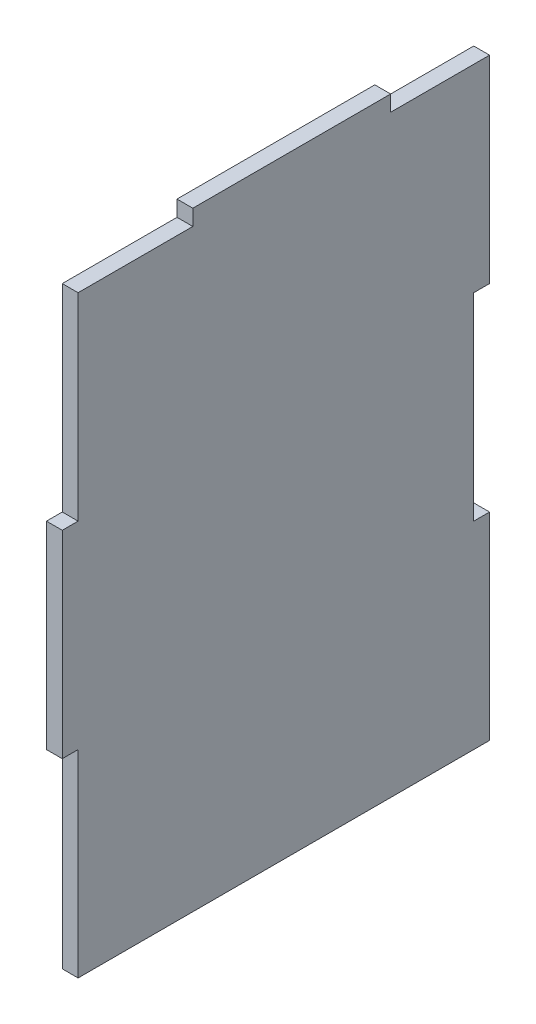
ISO-10303-21;
HEADER;
FILE_DESCRIPTION(('STEP AP214'),'2;1');
FILE_NAME('part.step','',(''),(''),'','','');
FILE_SCHEMA(('AUTOMOTIVE_DESIGN { 1 0 10303 214 1 1 1 1 }'));
ENDSEC;
DATA;
#1=APPLICATION_CONTEXT('core data for automotive mechanical design processes');
#2=APPLICATION_PROTOCOL_DEFINITION('international standard','automotive_design',2000,#1);
#3=PRODUCT_CONTEXT('',#1,'mechanical');
#4=PRODUCT('Part','Part','',(#3));
#5=PRODUCT_RELATED_PRODUCT_CATEGORY('part','',(#4));
#6=PRODUCT_DEFINITION_FORMATION('','',#4);
#7=PRODUCT_DEFINITION_CONTEXT('part definition',#1,'design');
#8=PRODUCT_DEFINITION('design','',#6,#7);
#9=PRODUCT_DEFINITION_SHAPE('','',#8);
#10=(LENGTH_UNIT() NAMED_UNIT(*) SI_UNIT(.MILLI.,.METRE.));
#11=(NAMED_UNIT(*) PLANE_ANGLE_UNIT() SI_UNIT($,.RADIAN.));
#12=(NAMED_UNIT(*) SI_UNIT($,.STERADIAN.) SOLID_ANGLE_UNIT());
#13=UNCERTAINTY_MEASURE_WITH_UNIT(LENGTH_MEASURE(1.E-05),#10,'distance_accuracy_value','');
#14=(GEOMETRIC_REPRESENTATION_CONTEXT(3) GLOBAL_UNCERTAINTY_ASSIGNED_CONTEXT((#13)) GLOBAL_UNIT_ASSIGNED_CONTEXT((#10,
#11,#12)) REPRESENTATION_CONTEXT('',''));
#15=CARTESIAN_POINT('',(0.,0.,0.));
#16=DIRECTION('',(0.,0.,1.));
#17=DIRECTION('',(1.,0.,0.));
#18=AXIS2_PLACEMENT_3D('',#15,#16,#17);
#19=CARTESIAN_POINT('',(4.,0.,0.));
#20=DIRECTION('',(0.,1.,0.));
#21=DIRECTION('',(0.,0.,1.));
#22=AXIS2_PLACEMENT_3D('',#19,#20,#21);
#23=PLANE('',#22);
#24=DIRECTION('',(0.,0.,-1.));
#25=VECTOR('',#24,1.);
#26=CARTESIAN_POINT('',(0.,0.,0.));
#27=LINE('',#26,#25);
#28=CARTESIAN_POINT('',(0.,0.,3.99999999999998));
#29=VERTEX_POINT('',#28);
#30=CARTESIAN_POINT('',(0.,0.,-100.));
#31=VERTEX_POINT('',#30);
#32=EDGE_CURVE('E123',#29,#31,#27,.T.);
#33=ORIENTED_EDGE('',*,*,#32,.T.);
#34=DIRECTION('',(-1.,0.,0.));
#35=VECTOR('',#34,1.);
#36=CARTESIAN_POINT('',(4.,0.,-100.));
#37=LINE('',#36,#35);
#38=CARTESIAN_POINT('',(4.,0.,-100.));
#39=VERTEX_POINT('',#38);
#40=EDGE_CURVE('E11',#39,#31,#37,.T.);
#41=ORIENTED_EDGE('',*,*,#40,.F.);
#42=DIRECTION('',(0.,0.,-1.));
#43=VECTOR('',#42,1.);
#44=CARTESIAN_POINT('',(4.,0.,3.99999999999998));
#45=LINE('',#44,#43);
#46=CARTESIAN_POINT('',(4.,0.,3.99999999999998));
#47=VERTEX_POINT('',#46);
#48=EDGE_CURVE('E129',#47,#39,#45,.T.);
#49=ORIENTED_EDGE('',*,*,#48,.F.);
#50=DIRECTION('',(-1.,0.,0.));
#51=VECTOR('',#50,1.);
#52=CARTESIAN_POINT('',(4.,0.,3.99999999999998));
#53=LINE('',#52,#51);
#54=EDGE_CURVE('E187',#47,#29,#53,.T.);
#55=ORIENTED_EDGE('',*,*,#54,.T.);
#56=EDGE_LOOP('',(#33,#41,#49,#55));
#57=FACE_BOUND('',#56,.T.);
#58=ADVANCED_FACE('F47',(#57),#23,.F.);
#59=CARTESIAN_POINT('',(4.,0.,-100.));
#60=DIRECTION('',(0.,0.,1.));
#61=DIRECTION('',(1.,0.,0.));
#62=AXIS2_PLACEMENT_3D('',#59,#60,#61);
#63=PLANE('',#62);
#64=DIRECTION('',(0.,1.,0.));
#65=VECTOR('',#64,1.);
#66=CARTESIAN_POINT('',(0.,0.,-100.));
#67=LINE('',#66,#65);
#68=CARTESIAN_POINT('',(0.,50.,-100.));
#69=VERTEX_POINT('',#68);
#70=EDGE_CURVE('E192',#31,#69,#67,.T.);
#71=ORIENTED_EDGE('',*,*,#70,.T.);
#72=DIRECTION('',(-1.,0.,0.));
#73=VECTOR('',#72,1.);
#74=CARTESIAN_POINT('',(4.,50.,-100.));
#75=LINE('',#74,#73);
#76=CARTESIAN_POINT('',(4.,50.,-100.));
#77=VERTEX_POINT('',#76);
#78=EDGE_CURVE('E55',#77,#69,#75,.T.);
#79=ORIENTED_EDGE('',*,*,#78,.F.);
#80=DIRECTION('',(0.,1.,0.));
#81=VECTOR('',#80,1.);
#82=CARTESIAN_POINT('',(4.,0.,-100.));
#83=LINE('',#82,#81);
#84=EDGE_CURVE('E309',#39,#77,#83,.T.);
#85=ORIENTED_EDGE('',*,*,#84,.F.);
#86=ORIENTED_EDGE('',*,*,#40,.T.);
#87=EDGE_LOOP('',(#71,#79,#85,#86));
#88=FACE_BOUND('',#87,.T.);
#89=ADVANCED_FACE('F312',(#88),#63,.F.);
#90=CARTESIAN_POINT('',(4.,50.,-96.));
#91=DIRECTION('',(0.,-1.,0.));
#92=DIRECTION('',(0.,0.,-1.));
#93=AXIS2_PLACEMENT_3D('',#90,#91,#92);
#94=PLANE('',#93);
#95=DIRECTION('',(0.,0.,1.));
#96=VECTOR('',#95,1.);
#97=CARTESIAN_POINT('',(0.,50.,-96.));
#98=LINE('',#97,#96);
#99=CARTESIAN_POINT('',(0.,50.,-96.));
#100=VERTEX_POINT('',#99);
#101=EDGE_CURVE('E194',#69,#100,#98,.T.);
#102=ORIENTED_EDGE('',*,*,#101,.T.);
#103=DIRECTION('',(-1.,0.,0.));
#104=VECTOR('',#103,1.);
#105=CARTESIAN_POINT('',(4.,50.,-96.));
#106=LINE('',#105,#104);
#107=CARTESIAN_POINT('',(4.,50.,-96.));
#108=VERTEX_POINT('',#107);
#109=EDGE_CURVE('E252',#108,#100,#106,.T.);
#110=ORIENTED_EDGE('',*,*,#109,.F.);
#111=DIRECTION('',(0.,0.,1.));
#112=VECTOR('',#111,1.);
#113=CARTESIAN_POINT('',(4.,50.,-96.));
#114=LINE('',#113,#112);
#115=EDGE_CURVE('E261',#77,#108,#114,.T.);
#116=ORIENTED_EDGE('',*,*,#115,.F.);
#117=ORIENTED_EDGE('',*,*,#78,.T.);
#118=EDGE_LOOP('',(#102,#110,#116,#117));
#119=FACE_BOUND('',#118,.T.);
#120=ADVANCED_FACE('F259',(#119),#94,.F.);
#121=CARTESIAN_POINT('',(4.,100.,-96.));
#122=DIRECTION('',(0.,0.,1.));
#123=DIRECTION('',(1.,0.,0.));
#124=AXIS2_PLACEMENT_3D('',#121,#122,#123);
#125=PLANE('',#124);
#126=DIRECTION('',(0.,1.,0.));
#127=VECTOR('',#126,1.);
#128=CARTESIAN_POINT('',(0.,100.,-96.));
#129=LINE('',#128,#127);
#130=CARTESIAN_POINT('',(0.,100.,-96.));
#131=VERTEX_POINT('',#130);
#132=EDGE_CURVE('E196',#100,#131,#129,.T.);
#133=ORIENTED_EDGE('',*,*,#132,.T.);
#134=DIRECTION('',(-1.,0.,0.));
#135=VECTOR('',#134,1.);
#136=CARTESIAN_POINT('',(4.,100.,-96.));
#137=LINE('',#136,#135);
#138=CARTESIAN_POINT('',(4.,100.,-96.));
#139=VERTEX_POINT('',#138);
#140=EDGE_CURVE('E249',#139,#131,#137,.T.);
#141=ORIENTED_EDGE('',*,*,#140,.F.);
#142=DIRECTION('',(0.,1.,0.));
#143=VECTOR('',#142,1.);
#144=CARTESIAN_POINT('',(4.,100.,-96.));
#145=LINE('',#144,#143);
#146=EDGE_CURVE('E279',#108,#139,#145,.T.);
#147=ORIENTED_EDGE('',*,*,#146,.F.);
#148=ORIENTED_EDGE('',*,*,#109,.T.);
#149=EDGE_LOOP('',(#133,#141,#147,#148));
#150=FACE_BOUND('',#149,.T.);
#151=ADVANCED_FACE('F270',(#150),#125,.F.);
#152=CARTESIAN_POINT('',(4.,100.,-100.));
#153=DIRECTION('',(0.,1.,0.));
#154=DIRECTION('',(0.,0.,1.));
#155=AXIS2_PLACEMENT_3D('',#152,#153,#154);
#156=PLANE('',#155);
#157=DIRECTION('',(0.,0.,-1.));
#158=VECTOR('',#157,1.);
#159=CARTESIAN_POINT('',(0.,100.,-100.));
#160=LINE('',#159,#158);
#161=CARTESIAN_POINT('',(0.,100.,-100.));
#162=VERTEX_POINT('',#161);
#163=EDGE_CURVE('E198',#131,#162,#160,.T.);
#164=ORIENTED_EDGE('',*,*,#163,.T.);
#165=DIRECTION('',(-1.,0.,0.));
#166=VECTOR('',#165,1.);
#167=CARTESIAN_POINT('',(4.,100.,-100.));
#168=LINE('',#167,#166);
#169=CARTESIAN_POINT('',(4.,100.,-100.));
#170=VERTEX_POINT('',#169);
#171=EDGE_CURVE('E246',#170,#162,#168,.T.);
#172=ORIENTED_EDGE('',*,*,#171,.F.);
#173=DIRECTION('',(0.,0.,-1.));
#174=VECTOR('',#173,1.);
#175=CARTESIAN_POINT('',(4.,100.,-100.));
#176=LINE('',#175,#174);
#177=EDGE_CURVE('E276',#139,#170,#176,.T.);
#178=ORIENTED_EDGE('',*,*,#177,.F.);
#179=ORIENTED_EDGE('',*,*,#140,.T.);
#180=EDGE_LOOP('',(#164,#172,#178,#179));
#181=FACE_BOUND('',#180,.T.);
#182=ADVANCED_FACE('F274',(#181),#156,.F.);
#183=CARTESIAN_POINT('',(4.,100.,-100.));
#184=DIRECTION('',(0.,0.,1.));
#185=DIRECTION('',(1.,0.,0.));
#186=AXIS2_PLACEMENT_3D('',#183,#184,#185);
#187=PLANE('',#186);
#188=DIRECTION('',(0.,1.,0.));
#189=VECTOR('',#188,1.);
#190=CARTESIAN_POINT('',(0.,100.,-100.));
#191=LINE('',#190,#189);
#192=CARTESIAN_POINT('',(0.,150.,-100.));
#193=VERTEX_POINT('',#192);
#194=EDGE_CURVE('E200',#162,#193,#191,.T.);
#195=ORIENTED_EDGE('',*,*,#194,.T.);
#196=DIRECTION('',(-1.,0.,0.));
#197=VECTOR('',#196,1.);
#198=CARTESIAN_POINT('',(4.,150.,-100.));
#199=LINE('',#198,#197);
#200=CARTESIAN_POINT('',(4.,150.,-100.));
#201=VERTEX_POINT('',#200);
#202=EDGE_CURVE('E243',#201,#193,#199,.T.);
#203=ORIENTED_EDGE('',*,*,#202,.F.);
#204=DIRECTION('',(0.,1.,0.));
#205=VECTOR('',#204,1.);
#206=CARTESIAN_POINT('',(4.,100.,-100.));
#207=LINE('',#206,#205);
#208=EDGE_CURVE('E278',#170,#201,#207,.T.);
#209=ORIENTED_EDGE('',*,*,#208,.F.);
#210=ORIENTED_EDGE('',*,*,#171,.T.);
#211=EDGE_LOOP('',(#195,#203,#209,#210));
#212=FACE_BOUND('',#211,.T.);
#213=ADVANCED_FACE('F324',(#212),#187,.F.);
#214=CARTESIAN_POINT('',(4.,150.,-100.));
#215=DIRECTION('',(0.,-1.,0.));
#216=DIRECTION('',(0.,0.,-1.));
#217=AXIS2_PLACEMENT_3D('',#214,#215,#216);
#218=PLANE('',#217);
#219=DIRECTION('',(0.,0.,1.));
#220=VECTOR('',#219,1.);
#221=CARTESIAN_POINT('',(0.,150.,-100.));
#222=LINE('',#221,#220);
#223=CARTESIAN_POINT('',(0.,150.,-75.));
#224=VERTEX_POINT('',#223);
#225=EDGE_CURVE('E202',#193,#224,#222,.T.);
#226=ORIENTED_EDGE('',*,*,#225,.T.);
#227=DIRECTION('',(-1.,0.,0.));
#228=VECTOR('',#227,1.);
#229=CARTESIAN_POINT('',(4.,150.,-75.));
#230=LINE('',#229,#228);
#231=CARTESIAN_POINT('',(4.,150.,-75.));
#232=VERTEX_POINT('',#231);
#233=EDGE_CURVE('E240',#232,#224,#230,.T.);
#234=ORIENTED_EDGE('',*,*,#233,.F.);
#235=DIRECTION('',(0.,0.,1.));
#236=VECTOR('',#235,1.);
#237=CARTESIAN_POINT('',(4.,150.,-100.));
#238=LINE('',#237,#236);
#239=EDGE_CURVE('E281',#201,#232,#238,.T.);
#240=ORIENTED_EDGE('',*,*,#239,.F.);
#241=ORIENTED_EDGE('',*,*,#202,.T.);
#242=EDGE_LOOP('',(#226,#234,#240,#241));
#243=FACE_BOUND('',#242,.T.);
#244=ADVANCED_FACE('F327',(#243),#218,.F.);
#245=CARTESIAN_POINT('',(4.,154.,-75.));
#246=DIRECTION('',(0.,0.,1.));
#247=DIRECTION('',(1.,0.,0.));
#248=AXIS2_PLACEMENT_3D('',#245,#246,#247);
#249=PLANE('',#248);
#250=DIRECTION('',(0.,1.,0.));
#251=VECTOR('',#250,1.);
#252=CARTESIAN_POINT('',(0.,154.,-75.));
#253=LINE('',#252,#251);
#254=CARTESIAN_POINT('',(0.,154.,-75.));
#255=VERTEX_POINT('',#254);
#256=EDGE_CURVE('E204',#224,#255,#253,.T.);
#257=ORIENTED_EDGE('',*,*,#256,.T.);
#258=DIRECTION('',(-1.,0.,0.));
#259=VECTOR('',#258,1.);
#260=CARTESIAN_POINT('',(4.,154.,-75.));
#261=LINE('',#260,#259);
#262=CARTESIAN_POINT('',(4.,154.,-75.));
#263=VERTEX_POINT('',#262);
#264=EDGE_CURVE('E237',#263,#255,#261,.T.);
#265=ORIENTED_EDGE('',*,*,#264,.F.);
#266=DIRECTION('',(0.,1.,0.));
#267=VECTOR('',#266,1.);
#268=CARTESIAN_POINT('',(4.,154.,-75.));
#269=LINE('',#268,#267);
#270=EDGE_CURVE('E287',#232,#263,#269,.T.);
#271=ORIENTED_EDGE('',*,*,#270,.F.);
#272=ORIENTED_EDGE('',*,*,#233,.T.);
#273=EDGE_LOOP('',(#257,#265,#271,#272));
#274=FACE_BOUND('',#273,.T.);
#275=ADVANCED_FACE('F331',(#274),#249,.F.);
#276=CARTESIAN_POINT('',(4.,154.,-25.));
#277=DIRECTION('',(0.,-1.,0.));
#278=DIRECTION('',(0.,0.,-1.));
#279=AXIS2_PLACEMENT_3D('',#276,#277,#278);
#280=PLANE('',#279);
#281=DIRECTION('',(0.,0.,1.));
#282=VECTOR('',#281,1.);
#283=CARTESIAN_POINT('',(0.,154.,-25.));
#284=LINE('',#283,#282);
#285=CARTESIAN_POINT('',(0.,154.,-25.));
#286=VERTEX_POINT('',#285);
#287=EDGE_CURVE('E206',#255,#286,#284,.T.);
#288=ORIENTED_EDGE('',*,*,#287,.T.);
#289=DIRECTION('',(-1.,0.,0.));
#290=VECTOR('',#289,1.);
#291=CARTESIAN_POINT('',(4.,154.,-25.));
#292=LINE('',#291,#290);
#293=CARTESIAN_POINT('',(4.,154.,-25.));
#294=VERTEX_POINT('',#293);
#295=EDGE_CURVE('E234',#294,#286,#292,.T.);
#296=ORIENTED_EDGE('',*,*,#295,.F.);
#297=DIRECTION('',(0.,0.,1.));
#298=VECTOR('',#297,1.);
#299=CARTESIAN_POINT('',(4.,154.,-25.));
#300=LINE('',#299,#298);
#301=EDGE_CURVE('E289',#263,#294,#300,.T.);
#302=ORIENTED_EDGE('',*,*,#301,.F.);
#303=ORIENTED_EDGE('',*,*,#264,.T.);
#304=EDGE_LOOP('',(#288,#296,#302,#303));
#305=FACE_BOUND('',#304,.T.);
#306=ADVANCED_FACE('F335',(#305),#280,.F.);
#307=CARTESIAN_POINT('',(4.,150.,-25.));
#308=DIRECTION('',(0.,0.,-1.));
#309=DIRECTION('',(-1.,0.,0.));
#310=AXIS2_PLACEMENT_3D('',#307,#308,#309);
#311=PLANE('',#310);
#312=DIRECTION('',(0.,-1.,0.));
#313=VECTOR('',#312,1.);
#314=CARTESIAN_POINT('',(0.,150.,-25.));
#315=LINE('',#314,#313);
#316=CARTESIAN_POINT('',(0.,150.,-25.));
#317=VERTEX_POINT('',#316);
#318=EDGE_CURVE('E208',#286,#317,#315,.T.);
#319=ORIENTED_EDGE('',*,*,#318,.T.);
#320=DIRECTION('',(-1.,0.,0.));
#321=VECTOR('',#320,1.);
#322=CARTESIAN_POINT('',(4.,150.,-25.));
#323=LINE('',#322,#321);
#324=CARTESIAN_POINT('',(4.,150.,-25.));
#325=VERTEX_POINT('',#324);
#326=EDGE_CURVE('E231',#325,#317,#323,.T.);
#327=ORIENTED_EDGE('',*,*,#326,.F.);
#328=DIRECTION('',(0.,-1.,0.));
#329=VECTOR('',#328,1.);
#330=CARTESIAN_POINT('',(4.,150.,-25.));
#331=LINE('',#330,#329);
#332=EDGE_CURVE('E291',#294,#325,#331,.T.);
#333=ORIENTED_EDGE('',*,*,#332,.F.);
#334=ORIENTED_EDGE('',*,*,#295,.T.);
#335=EDGE_LOOP('',(#319,#327,#333,#334));
#336=FACE_BOUND('',#335,.T.);
#337=ADVANCED_FACE('F339',(#336),#311,.F.);
#338=CARTESIAN_POINT('',(4.,150.,0.));
#339=DIRECTION('',(0.,-1.,0.));
#340=DIRECTION('',(0.,0.,-1.));
#341=AXIS2_PLACEMENT_3D('',#338,#339,#340);
#342=PLANE('',#341);
#343=DIRECTION('',(0.,0.,1.));
#344=VECTOR('',#343,1.);
#345=CARTESIAN_POINT('',(0.,150.,0.));
#346=LINE('',#345,#344);
#347=CARTESIAN_POINT('',(0.,150.,3.99999999999995));
#348=VERTEX_POINT('',#347);
#349=EDGE_CURVE('E211',#317,#348,#346,.T.);
#350=ORIENTED_EDGE('',*,*,#349,.T.);
#351=DIRECTION('',(-1.,0.,0.));
#352=VECTOR('',#351,1.);
#353=CARTESIAN_POINT('',(4.,150.,3.99999999999995));
#354=LINE('',#353,#352);
#355=CARTESIAN_POINT('',(4.,150.,3.99999999999995));
#356=VERTEX_POINT('',#355);
#357=EDGE_CURVE('E228',#356,#348,#354,.T.);
#358=ORIENTED_EDGE('',*,*,#357,.F.);
#359=DIRECTION('',(0.,0.,1.));
#360=VECTOR('',#359,1.);
#361=CARTESIAN_POINT('',(4.,150.,-25.));
#362=LINE('',#361,#360);
#363=EDGE_CURVE('E293',#325,#356,#362,.T.);
#364=ORIENTED_EDGE('',*,*,#363,.F.);
#365=ORIENTED_EDGE('',*,*,#326,.T.);
#366=EDGE_LOOP('',(#350,#358,#364,#365));
#367=FACE_BOUND('',#366,.T.);
#368=ADVANCED_FACE('F343',(#367),#342,.F.);
#369=CARTESIAN_POINT('',(4.,150.,3.99999999999995));
#370=DIRECTION('',(0.,0.,-1.));
#371=DIRECTION('',(-1.,0.,0.));
#372=AXIS2_PLACEMENT_3D('',#369,#370,#371);
#373=PLANE('',#372);
#374=DIRECTION('',(0.,-1.,0.));
#375=VECTOR('',#374,1.);
#376=CARTESIAN_POINT('',(0.,150.,3.99999999999995));
#377=LINE('',#376,#375);
#378=CARTESIAN_POINT('',(0.,100.,3.99999999999995));
#379=VERTEX_POINT('',#378);
#380=EDGE_CURVE('E213',#348,#379,#377,.T.);
#381=ORIENTED_EDGE('',*,*,#380,.T.);
#382=DIRECTION('',(-1.,0.,0.));
#383=VECTOR('',#382,1.);
#384=CARTESIAN_POINT('',(4.,100.,3.99999999999995));
#385=LINE('',#384,#383);
#386=CARTESIAN_POINT('',(4.,100.,3.99999999999995));
#387=VERTEX_POINT('',#386);
#388=EDGE_CURVE('E225',#387,#379,#385,.T.);
#389=ORIENTED_EDGE('',*,*,#388,.F.);
#390=DIRECTION('',(0.,-1.,0.));
#391=VECTOR('',#390,1.);
#392=CARTESIAN_POINT('',(4.,150.,3.99999999999995));
#393=LINE('',#392,#391);
#394=EDGE_CURVE('E295',#356,#387,#393,.T.);
#395=ORIENTED_EDGE('',*,*,#394,.F.);
#396=ORIENTED_EDGE('',*,*,#357,.T.);
#397=EDGE_LOOP('',(#381,#389,#395,#396));
#398=FACE_BOUND('',#397,.T.);
#399=ADVANCED_FACE('F301',(#398),#373,.F.);
#400=CARTESIAN_POINT('',(4.,100.,3.99999999999995));
#401=DIRECTION('',(0.,-1.,0.));
#402=DIRECTION('',(0.,0.,-1.));
#403=AXIS2_PLACEMENT_3D('',#400,#401,#402);
#404=PLANE('',#403);
#405=DIRECTION('',(0.,0.,1.));
#406=VECTOR('',#405,1.);
#407=CARTESIAN_POINT('',(0.,100.,3.99999999999995));
#408=LINE('',#407,#406);
#409=CARTESIAN_POINT('',(0.,100.,7.99999999999995));
#410=VERTEX_POINT('',#409);
#411=EDGE_CURVE('E215',#379,#410,#408,.T.);
#412=ORIENTED_EDGE('',*,*,#411,.T.);
#413=DIRECTION('',(-1.,0.,0.));
#414=VECTOR('',#413,1.);
#415=CARTESIAN_POINT('',(4.,100.,7.99999999999995));
#416=LINE('',#415,#414);
#417=CARTESIAN_POINT('',(4.,100.,7.99999999999995));
#418=VERTEX_POINT('',#417);
#419=EDGE_CURVE('E182',#418,#410,#416,.T.);
#420=ORIENTED_EDGE('',*,*,#419,.F.);
#421=DIRECTION('',(0.,0.,1.));
#422=VECTOR('',#421,1.);
#423=CARTESIAN_POINT('',(4.,100.,3.99999999999995));
#424=LINE('',#423,#422);
#425=EDGE_CURVE('E173',#387,#418,#424,.T.);
#426=ORIENTED_EDGE('',*,*,#425,.F.);
#427=ORIENTED_EDGE('',*,*,#388,.T.);
#428=EDGE_LOOP('',(#412,#420,#426,#427));
#429=FACE_BOUND('',#428,.T.);
#430=ADVANCED_FACE('F305',(#429),#404,.F.);
#431=CARTESIAN_POINT('',(4.,100.,7.99999999999995));
#432=DIRECTION('',(0.,0.,-1.));
#433=DIRECTION('',(-1.,0.,0.));
#434=AXIS2_PLACEMENT_3D('',#431,#432,#433);
#435=PLANE('',#434);
#436=DIRECTION('',(0.,-1.,0.));
#437=VECTOR('',#436,1.);
#438=CARTESIAN_POINT('',(0.,100.,7.99999999999995));
#439=LINE('',#438,#437);
#440=CARTESIAN_POINT('',(0.,50.,7.99999999999995));
#441=VERTEX_POINT('',#440);
#442=EDGE_CURVE('E181',#410,#441,#439,.T.);
#443=ORIENTED_EDGE('',*,*,#442,.T.);
#444=DIRECTION('',(-1.,0.,0.));
#445=VECTOR('',#444,1.);
#446=CARTESIAN_POINT('',(4.,50.,7.99999999999995));
#447=LINE('',#446,#445);
#448=CARTESIAN_POINT('',(4.,50.,7.99999999999995));
#449=VERTEX_POINT('',#448);
#450=EDGE_CURVE('E178',#449,#441,#447,.T.);
#451=ORIENTED_EDGE('',*,*,#450,.F.);
#452=DIRECTION('',(0.,-1.,0.));
#453=VECTOR('',#452,1.);
#454=CARTESIAN_POINT('',(4.,100.,7.99999999999995));
#455=LINE('',#454,#453);
#456=EDGE_CURVE('E167',#418,#449,#455,.T.);
#457=ORIENTED_EDGE('',*,*,#456,.F.);
#458=ORIENTED_EDGE('',*,*,#419,.T.);
#459=EDGE_LOOP('',(#443,#451,#457,#458));
#460=FACE_BOUND('',#459,.T.);
#461=ADVANCED_FACE('F179',(#460),#435,.F.);
#462=CARTESIAN_POINT('',(4.,50.,7.99999999999995));
#463=DIRECTION('',(0.,1.,0.));
#464=DIRECTION('',(0.,0.,1.));
#465=AXIS2_PLACEMENT_3D('',#462,#463,#464);
#466=PLANE('',#465);
#467=DIRECTION('',(0.,0.,-1.));
#468=VECTOR('',#467,1.);
#469=CARTESIAN_POINT('',(0.,50.,7.99999999999995));
#470=LINE('',#469,#468);
#471=CARTESIAN_POINT('',(0.,50.,3.99999999999995));
#472=VERTEX_POINT('',#471);
#473=EDGE_CURVE('E116',#441,#472,#470,.T.);
#474=ORIENTED_EDGE('',*,*,#473,.T.);
#475=DIRECTION('',(-1.,0.,0.));
#476=VECTOR('',#475,1.);
#477=CARTESIAN_POINT('',(4.,50.,3.99999999999995));
#478=LINE('',#477,#476);
#479=CARTESIAN_POINT('',(4.,50.,3.99999999999995));
#480=VERTEX_POINT('',#479);
#481=EDGE_CURVE('E183',#480,#472,#478,.T.);
#482=ORIENTED_EDGE('',*,*,#481,.F.);
#483=DIRECTION('',(0.,0.,-1.));
#484=VECTOR('',#483,1.);
#485=CARTESIAN_POINT('',(4.,50.,7.99999999999995));
#486=LINE('',#485,#484);
#487=EDGE_CURVE('E171',#449,#480,#486,.T.);
#488=ORIENTED_EDGE('',*,*,#487,.F.);
#489=ORIENTED_EDGE('',*,*,#450,.T.);
#490=EDGE_LOOP('',(#474,#482,#488,#489));
#491=FACE_BOUND('',#490,.T.);
#492=ADVANCED_FACE('F185',(#491),#466,.F.);
#493=CARTESIAN_POINT('',(4.,50.,3.99999999999995));
#494=DIRECTION('',(0.,0.,-1.));
#495=DIRECTION('',(0.,1.,0.));
#496=AXIS2_PLACEMENT_3D('',#493,#494,#495);
#497=PLANE('',#496);
#498=DIRECTION('',(0.,-1.,0.));
#499=VECTOR('',#498,1.);
#500=CARTESIAN_POINT('',(0.,50.,3.99999999999995));
#501=LINE('',#500,#499);
#502=EDGE_CURVE('E219',#472,#29,#501,.T.);
#503=ORIENTED_EDGE('',*,*,#502,.T.);
#504=ORIENTED_EDGE('',*,*,#54,.F.);
#505=DIRECTION('',(0.,-1.,0.));
#506=VECTOR('',#505,1.);
#507=CARTESIAN_POINT('',(4.,50.,3.99999999999995));
#508=LINE('',#507,#506);
#509=EDGE_CURVE('E63',#480,#47,#508,.T.);
#510=ORIENTED_EDGE('',*,*,#509,.F.);
#511=ORIENTED_EDGE('',*,*,#481,.T.);
#512=EDGE_LOOP('',(#503,#504,#510,#511));
#513=FACE_BOUND('',#512,.T.);
#514=ADVANCED_FACE('F307',(#513),#497,.F.);
#515=CARTESIAN_POINT('',(4.,0.,0.));
#516=DIRECTION('',(1.,0.,0.));
#517=DIRECTION('',(0.,0.,-1.));
#518=AXIS2_PLACEMENT_3D('',#515,#516,#517);
#519=PLANE('',#518);
#520=ORIENTED_EDGE('',*,*,#48,.T.);
#521=ORIENTED_EDGE('',*,*,#84,.T.);
#522=ORIENTED_EDGE('',*,*,#115,.T.);
#523=ORIENTED_EDGE('',*,*,#146,.T.);
#524=ORIENTED_EDGE('',*,*,#177,.T.);
#525=ORIENTED_EDGE('',*,*,#208,.T.);
#526=ORIENTED_EDGE('',*,*,#239,.T.);
#527=ORIENTED_EDGE('',*,*,#270,.T.);
#528=ORIENTED_EDGE('',*,*,#301,.T.);
#529=ORIENTED_EDGE('',*,*,#332,.T.);
#530=ORIENTED_EDGE('',*,*,#363,.T.);
#531=ORIENTED_EDGE('',*,*,#394,.T.);
#532=ORIENTED_EDGE('',*,*,#425,.T.);
#533=ORIENTED_EDGE('',*,*,#456,.T.);
#534=ORIENTED_EDGE('',*,*,#487,.T.);
#535=ORIENTED_EDGE('',*,*,#509,.T.);
#536=EDGE_LOOP('',(#520,#521,#522,#523,#524,#525,#526,#527,#528,#529,#530,#531,#532,#533,#534,#535));
#537=FACE_BOUND('',#536,.T.);
#538=ADVANCED_FACE('F169',(#537),#519,.T.);
#539=CARTESIAN_POINT('',(0.,0.,0.));
#540=DIRECTION('',(1.,0.,0.));
#541=DIRECTION('',(0.,0.,-1.));
#542=AXIS2_PLACEMENT_3D('',#539,#540,#541);
#543=PLANE('',#542);
#544=ORIENTED_EDGE('',*,*,#32,.F.);
#545=ORIENTED_EDGE('',*,*,#502,.F.);
#546=ORIENTED_EDGE('',*,*,#473,.F.);
#547=ORIENTED_EDGE('',*,*,#442,.F.);
#548=ORIENTED_EDGE('',*,*,#411,.F.);
#549=ORIENTED_EDGE('',*,*,#380,.F.);
#550=ORIENTED_EDGE('',*,*,#349,.F.);
#551=ORIENTED_EDGE('',*,*,#318,.F.);
#552=ORIENTED_EDGE('',*,*,#287,.F.);
#553=ORIENTED_EDGE('',*,*,#256,.F.);
#554=ORIENTED_EDGE('',*,*,#225,.F.);
#555=ORIENTED_EDGE('',*,*,#194,.F.);
#556=ORIENTED_EDGE('',*,*,#163,.F.);
#557=ORIENTED_EDGE('',*,*,#132,.F.);
#558=ORIENTED_EDGE('',*,*,#101,.F.);
#559=ORIENTED_EDGE('',*,*,#70,.F.);
#560=EDGE_LOOP('',(#544,#545,#546,#547,#548,#549,#550,#551,#552,#553,#554,#555,#556,#557,#558,#559));
#561=FACE_BOUND('',#560,.T.);
#562=ADVANCED_FACE('F265',(#561),#543,.F.);
#563=CLOSED_SHELL('',(#58,#89,#120,#151,#182,#213,#244,#275,#306,#337,#368,#399,#430,#461,#492,
#514,#538,#562));
#564=MANIFOLD_SOLID_BREP('B2',#563);
#565=ADVANCED_BREP_SHAPE_REPRESENTATION('',(#18,#564),#14);
#566=SHAPE_DEFINITION_REPRESENTATION(#9,#565);
ENDSEC;
END-ISO-10303-21;
